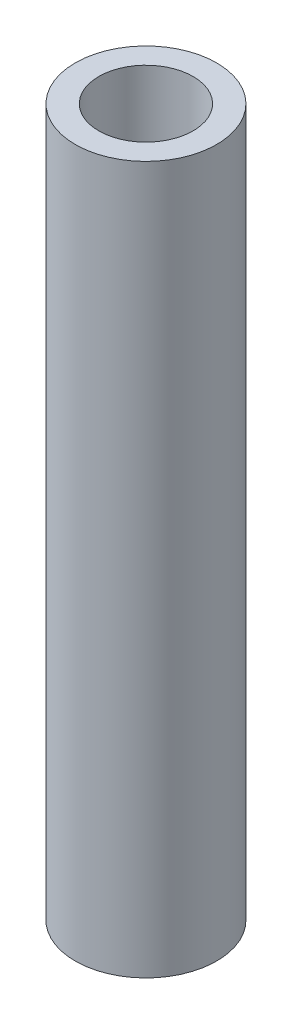
ISO-10303-21;
HEADER;
FILE_DESCRIPTION(('STEP AP214'),'2;1');
FILE_NAME('part.step','',(''),(''),'','','');
FILE_SCHEMA(('AUTOMOTIVE_DESIGN { 1 0 10303 214 1 1 1 1 }'));
ENDSEC;
DATA;
#1=APPLICATION_CONTEXT('core data for automotive mechanical design processes');
#2=APPLICATION_PROTOCOL_DEFINITION('international standard','automotive_design',2000,#1);
#3=PRODUCT_CONTEXT('',#1,'mechanical');
#4=PRODUCT('Part','Part','',(#3));
#5=PRODUCT_RELATED_PRODUCT_CATEGORY('part','',(#4));
#6=PRODUCT_DEFINITION_FORMATION('','',#4);
#7=PRODUCT_DEFINITION_CONTEXT('part definition',#1,'design');
#8=PRODUCT_DEFINITION('design','',#6,#7);
#9=PRODUCT_DEFINITION_SHAPE('','',#8);
#10=(LENGTH_UNIT() NAMED_UNIT(*) SI_UNIT(.MILLI.,.METRE.));
#11=(NAMED_UNIT(*) PLANE_ANGLE_UNIT() SI_UNIT($,.RADIAN.));
#12=(NAMED_UNIT(*) SI_UNIT($,.STERADIAN.) SOLID_ANGLE_UNIT());
#13=UNCERTAINTY_MEASURE_WITH_UNIT(LENGTH_MEASURE(1.E-05),#10,'distance_accuracy_value','');
#14=(GEOMETRIC_REPRESENTATION_CONTEXT(3) GLOBAL_UNCERTAINTY_ASSIGNED_CONTEXT((#13)) GLOBAL_UNIT_ASSIGNED_CONTEXT((#10,
#11,#12)) REPRESENTATION_CONTEXT('',''));
#15=CARTESIAN_POINT('',(0.,0.,0.));
#16=DIRECTION('',(0.,0.,1.));
#17=DIRECTION('',(1.,0.,0.));
#18=AXIS2_PLACEMENT_3D('',#15,#16,#17);
#19=CARTESIAN_POINT('',(0.,0.,0.));
#20=DIRECTION('',(0.,1.,0.));
#21=DIRECTION('',(1.,0.,0.));
#22=AXIS2_PLACEMENT_3D('',#19,#20,#21);
#23=PLANE('',#22);
#24=CARTESIAN_POINT('',(0.,0.,0.));
#25=DIRECTION('',(0.,-1.,0.));
#26=DIRECTION('',(1.,0.,0.));
#27=AXIS2_PLACEMENT_3D('',#24,#25,#26);
#28=CIRCLE('',#27,1.);
#29=CARTESIAN_POINT('',(-1.,0.,0.));
#30=VERTEX_POINT('',#29);
#31=EDGE_CURVE('E21',#30,#30,#28,.T.);
#32=ORIENTED_EDGE('',*,*,#31,.F.);
#33=EDGE_LOOP('',(#32));
#34=FACE_BOUND('',#33,.T.);
#35=CARTESIAN_POINT('',(0.,0.,0.));
#36=DIRECTION('',(0.,1.,0.));
#37=DIRECTION('',(1.,0.,0.));
#38=AXIS2_PLACEMENT_3D('',#35,#36,#37);
#39=CIRCLE('',#38,1.5);
#40=CARTESIAN_POINT('',(-1.5,0.,0.));
#41=VERTEX_POINT('',#40);
#42=EDGE_CURVE('E11',#41,#41,#39,.T.);
#43=ORIENTED_EDGE('',*,*,#42,.F.);
#44=EDGE_LOOP('',(#43));
#45=FACE_BOUND('',#44,.T.);
#46=ADVANCED_FACE('F17',(#34,#45),#23,.F.);
#47=CARTESIAN_POINT('',(0.,-0.75,0.));
#48=DIRECTION('',(0.,1.,0.));
#49=DIRECTION('',(1.,0.,0.));
#50=AXIS2_PLACEMENT_3D('',#47,#48,#49);
#51=CYLINDRICAL_SURFACE('',#50,1.5);
#52=CARTESIAN_POINT('',(0.,15.,0.));
#53=DIRECTION('',(0.,1.,0.));
#54=DIRECTION('',(1.,0.,0.));
#55=AXIS2_PLACEMENT_3D('',#52,#53,#54);
#56=CIRCLE('',#55,1.5);
#57=CARTESIAN_POINT('',(-1.5,15.,0.));
#58=VERTEX_POINT('',#57);
#59=EDGE_CURVE('E66',#58,#58,#56,.T.);
#60=ORIENTED_EDGE('',*,*,#59,.F.);
#61=DIRECTION('',(0.,-1.,0.));
#62=VECTOR('',#61,1.);
#63=CARTESIAN_POINT('',(-1.5,-0.75,0.));
#64=LINE('',#63,#62);
#65=EDGE_CURVE('E27',#58,#41,#64,.T.);
#66=ORIENTED_EDGE('',*,*,#65,.T.);
#67=ORIENTED_EDGE('',*,*,#42,.T.);
#68=ORIENTED_EDGE('',*,*,#65,.F.);
#69=EDGE_LOOP('',(#60,#66,#67,#68));
#70=FACE_BOUND('',#69,.T.);
#71=ADVANCED_FACE('F19',(#70),#51,.T.);
#72=CARTESIAN_POINT('',(0.,15.,0.));
#73=DIRECTION('',(0.,1.,0.));
#74=DIRECTION('',(1.,0.,0.));
#75=AXIS2_PLACEMENT_3D('',#72,#73,#74);
#76=PLANE('',#75);
#77=CARTESIAN_POINT('',(0.,15.,0.));
#78=DIRECTION('',(0.,1.,0.));
#79=DIRECTION('',(1.,0.,0.));
#80=AXIS2_PLACEMENT_3D('',#77,#78,#79);
#81=CIRCLE('',#80,1.);
#82=CARTESIAN_POINT('',(-1.,15.,0.));
#83=VERTEX_POINT('',#82);
#84=EDGE_CURVE('E58',#83,#83,#81,.T.);
#85=ORIENTED_EDGE('',*,*,#84,.F.);
#86=EDGE_LOOP('',(#85));
#87=FACE_BOUND('',#86,.T.);
#88=ORIENTED_EDGE('',*,*,#59,.T.);
#89=EDGE_LOOP('',(#88));
#90=FACE_BOUND('',#89,.T.);
#91=ADVANCED_FACE('F74',(#87,#90),#76,.T.);
#92=CARTESIAN_POINT('',(0.,-0.75,0.));
#93=DIRECTION('',(0.,1.,0.));
#94=DIRECTION('',(1.,0.,0.));
#95=AXIS2_PLACEMENT_3D('',#92,#93,#94);
#96=CYLINDRICAL_SURFACE('',#95,1.);
#97=ORIENTED_EDGE('',*,*,#31,.T.);
#98=DIRECTION('',(0.,1.,0.));
#99=VECTOR('',#98,1.);
#100=CARTESIAN_POINT('',(-1.,-0.75,0.));
#101=LINE('',#100,#99);
#102=EDGE_CURVE('E54',#30,#83,#101,.T.);
#103=ORIENTED_EDGE('',*,*,#102,.T.);
#104=ORIENTED_EDGE('',*,*,#84,.T.);
#105=ORIENTED_EDGE('',*,*,#102,.F.);
#106=EDGE_LOOP('',(#97,#103,#104,#105));
#107=FACE_BOUND('',#106,.T.);
#108=ADVANCED_FACE('F55',(#107),#96,.F.);
#109=CLOSED_SHELL('',(#46,#71,#91,#108));
#110=MANIFOLD_SOLID_BREP('B1',#109);
#111=ADVANCED_BREP_SHAPE_REPRESENTATION('',(#18,#110),#14);
#112=SHAPE_DEFINITION_REPRESENTATION(#9,#111);
ENDSEC;
END-ISO-10303-21;
